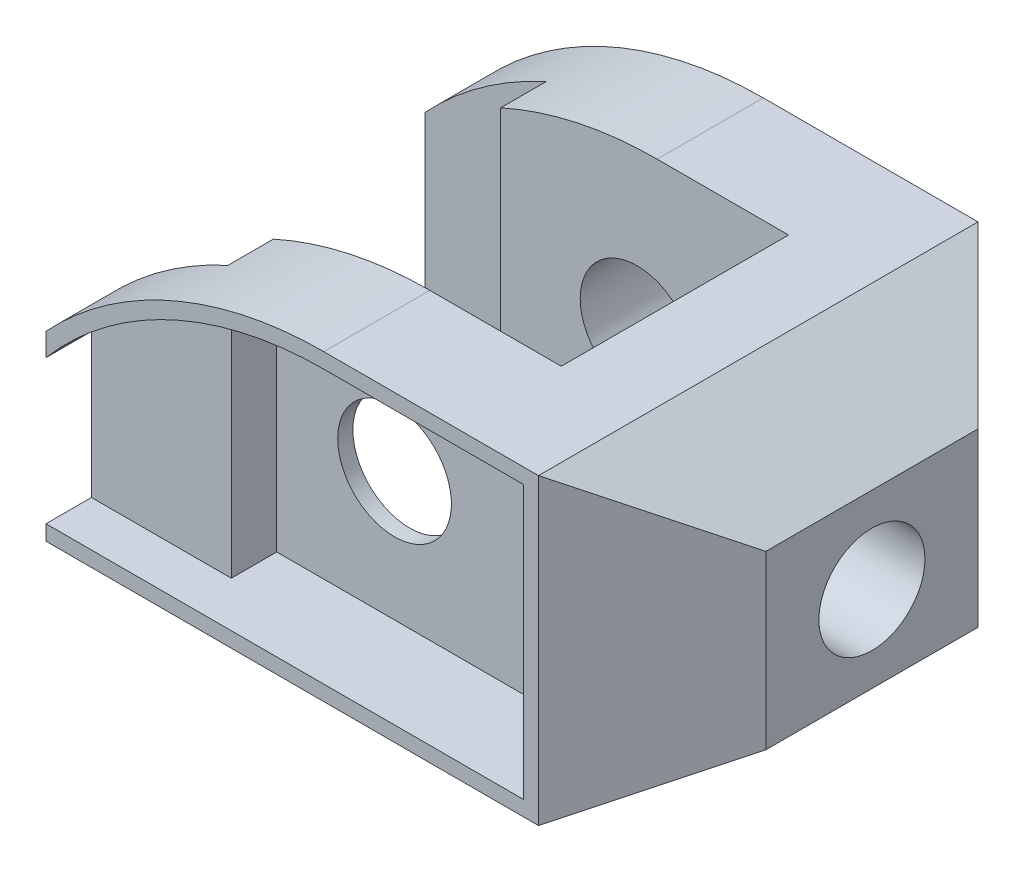
ISO-10303-21;
HEADER;
FILE_DESCRIPTION(('STEP AP214'),'2;1');
FILE_NAME('part.step','',(''),(''),'','','');
FILE_SCHEMA(('AUTOMOTIVE_DESIGN { 1 0 10303 214 1 1 1 1 }'));
ENDSEC;
DATA;
#1=APPLICATION_CONTEXT('core data for automotive mechanical design processes');
#2=APPLICATION_PROTOCOL_DEFINITION('international standard','automotive_design',2000,#1);
#3=PRODUCT_CONTEXT('',#1,'mechanical');
#4=PRODUCT('Part','Part','',(#3));
#5=PRODUCT_RELATED_PRODUCT_CATEGORY('part','',(#4));
#6=PRODUCT_DEFINITION_FORMATION('','',#4);
#7=PRODUCT_DEFINITION_CONTEXT('part definition',#1,'design');
#8=PRODUCT_DEFINITION('design','',#6,#7);
#9=PRODUCT_DEFINITION_SHAPE('','',#8);
#10=(LENGTH_UNIT() NAMED_UNIT(*) SI_UNIT(.MILLI.,.METRE.));
#11=(NAMED_UNIT(*) PLANE_ANGLE_UNIT() SI_UNIT($,.RADIAN.));
#12=(NAMED_UNIT(*) SI_UNIT($,.STERADIAN.) SOLID_ANGLE_UNIT());
#13=UNCERTAINTY_MEASURE_WITH_UNIT(LENGTH_MEASURE(1.E-05),#10,'distance_accuracy_value','');
#14=(GEOMETRIC_REPRESENTATION_CONTEXT(3) GLOBAL_UNCERTAINTY_ASSIGNED_CONTEXT((#13)) GLOBAL_UNIT_ASSIGNED_CONTEXT((#10,
#11,#12)) REPRESENTATION_CONTEXT('',''));
#15=CARTESIAN_POINT('',(0.,0.,0.));
#16=DIRECTION('',(0.,0.,1.));
#17=DIRECTION('',(1.,0.,0.));
#18=AXIS2_PLACEMENT_3D('',#15,#16,#17);
#19=CARTESIAN_POINT('',(34.,19.,29.));
#20=DIRECTION('',(0.,0.,-1.));
#21=DIRECTION('',(-1.,0.,0.));
#22=AXIS2_PLACEMENT_3D('',#19,#20,#21);
#23=CYLINDRICAL_SURFACE('',#22,7.5);
#24=CARTESIAN_POINT('',(34.,19.,15.));
#25=DIRECTION('',(0.,0.,1.));
#26=DIRECTION('',(1.,0.,0.));
#27=AXIS2_PLACEMENT_3D('',#24,#25,#26);
#28=CIRCLE('',#27,7.5);
#29=CARTESIAN_POINT('',(26.5,19.,15.));
#30=VERTEX_POINT('',#29);
#31=EDGE_CURVE('E317',#30,#30,#28,.T.);
#32=CARTESIAN_POINT('',(34.,19.,17.));
#33=DIRECTION('',(0.,0.,1.));
#34=DIRECTION('',(1.,0.,0.));
#35=AXIS2_PLACEMENT_3D('',#32,#33,#34);
#36=CIRCLE('',#35,7.5);
#37=CARTESIAN_POINT('',(26.5,19.,17.));
#38=VERTEX_POINT('',#37);
#39=EDGE_CURVE('E46',#38,#38,#36,.T.);
#40=CARTESIAN_POINT('',(26.5,19.,15.));
#41=CARTESIAN_POINT('',(26.5,19.,15.0208333333333));
#42=CARTESIAN_POINT('',(26.5,19.,15.0416666666667));
#43=CARTESIAN_POINT('',(26.5,19.,15.0833333333333));
#44=CARTESIAN_POINT('',(26.5,19.,15.1041666666667));
#45=CARTESIAN_POINT('',(26.5,19.,15.1458333333333));
#46=CARTESIAN_POINT('',(26.5,19.,15.1666666666667));
#47=CARTESIAN_POINT('',(26.5,19.,15.2083333333333));
#48=CARTESIAN_POINT('',(26.5,19.,15.2291666666667));
#49=CARTESIAN_POINT('',(26.5,19.,15.2708333333333));
#50=CARTESIAN_POINT('',(26.5,19.,15.2916666666667));
#51=CARTESIAN_POINT('',(26.5,19.,15.3333333333333));
#52=CARTESIAN_POINT('',(26.5,19.,15.3541666666667));
#53=CARTESIAN_POINT('',(26.5,19.,15.3958333333333));
#54=CARTESIAN_POINT('',(26.5,19.,15.4166666666667));
#55=CARTESIAN_POINT('',(26.5,19.,15.4583333333333));
#56=CARTESIAN_POINT('',(26.5,19.,15.4791666666667));
#57=CARTESIAN_POINT('',(26.5,19.,15.5208333333333));
#58=CARTESIAN_POINT('',(26.5,19.,15.5416666666667));
#59=CARTESIAN_POINT('',(26.5,19.,15.5833333333333));
#60=CARTESIAN_POINT('',(26.5,19.,15.6041666666667));
#61=CARTESIAN_POINT('',(26.5,19.,15.6458333333333));
#62=CARTESIAN_POINT('',(26.5,19.,15.6666666666667));
#63=CARTESIAN_POINT('',(26.5,19.,15.7083333333333));
#64=CARTESIAN_POINT('',(26.5,19.,15.7291666666667));
#65=CARTESIAN_POINT('',(26.5,19.,15.7708333333333));
#66=CARTESIAN_POINT('',(26.5,19.,15.7916666666667));
#67=CARTESIAN_POINT('',(26.5,19.,15.8333333333333));
#68=CARTESIAN_POINT('',(26.5,19.,15.8541666666667));
#69=CARTESIAN_POINT('',(26.5,19.,15.8958333333333));
#70=CARTESIAN_POINT('',(26.5,19.,15.9166666666667));
#71=CARTESIAN_POINT('',(26.5,19.,15.9583333333333));
#72=CARTESIAN_POINT('',(26.5,19.,15.9791666666667));
#73=CARTESIAN_POINT('',(26.5,19.,16.0208333333333));
#74=CARTESIAN_POINT('',(26.5,19.,16.0416666666667));
#75=CARTESIAN_POINT('',(26.5,19.,16.0833333333333));
#76=CARTESIAN_POINT('',(26.5,19.,16.1041666666667));
#77=CARTESIAN_POINT('',(26.5,19.,16.1458333333333));
#78=CARTESIAN_POINT('',(26.5,19.,16.1666666666667));
#79=CARTESIAN_POINT('',(26.5,19.,16.2083333333333));
#80=CARTESIAN_POINT('',(26.5,19.,16.2291666666667));
#81=CARTESIAN_POINT('',(26.5,19.,16.2708333333333));
#82=CARTESIAN_POINT('',(26.5,19.,16.2916666666667));
#83=CARTESIAN_POINT('',(26.5,19.,16.3333333333333));
#84=CARTESIAN_POINT('',(26.5,19.,16.3541666666667));
#85=CARTESIAN_POINT('',(26.5,19.,16.3958333333333));
#86=CARTESIAN_POINT('',(26.5,19.,16.4166666666667));
#87=CARTESIAN_POINT('',(26.5,19.,16.4583333333333));
#88=CARTESIAN_POINT('',(26.5,19.,16.4791666666667));
#89=CARTESIAN_POINT('',(26.5,19.,16.5208333333333));
#90=CARTESIAN_POINT('',(26.5,19.,16.5416666666667));
#91=CARTESIAN_POINT('',(26.5,19.,16.5833333333333));
#92=CARTESIAN_POINT('',(26.5,19.,16.6041666666667));
#93=CARTESIAN_POINT('',(26.5,19.,16.6458333333333));
#94=CARTESIAN_POINT('',(26.5,19.,16.6666666666667));
#95=CARTESIAN_POINT('',(26.5,19.,16.7083333333333));
#96=CARTESIAN_POINT('',(26.5,19.,16.7291666666667));
#97=CARTESIAN_POINT('',(26.5,19.,16.7708333333333));
#98=CARTESIAN_POINT('',(26.5,19.,16.7916666666667));
#99=CARTESIAN_POINT('',(26.5,19.,16.8333333333333));
#100=CARTESIAN_POINT('',(26.5,19.,16.8541666666667));
#101=CARTESIAN_POINT('',(26.5,19.,16.8958333333333));
#102=CARTESIAN_POINT('',(26.5,19.,16.9166666666667));
#103=CARTESIAN_POINT('',(26.5,19.,16.9583333333333));
#104=CARTESIAN_POINT('',(26.5,19.,16.9791666666667));
#105=CARTESIAN_POINT('',(26.5,19.,17.));
#106=B_SPLINE_CURVE_WITH_KNOTS('',3,(#40,#41,#42,#43,#44,#45,#46,#47,#48,#49,#50,#51,#52,#53,
#54,#55,#56,#57,#58,#59,#60,#61,#62,#63,#64,#65,#66,#67,#68,#69,#70,#71,#72,#73,#74,#75,#76,#77,
#78,#79,#80,#81,#82,#83,#84,#85,#86,#87,#88,#89,#90,#91,#92,#93,#94,#95,#96,#97,#98,#99,#100,
#101,#102,#103,#104,#105),.UNSPECIFIED.,.F.,.F.,(4,2,2,2,2,2,2,2,2,2,2,2,2,2,2,2,2,2,2,2,2,2,2,
2,2,2,2,2,2,2,2,2,4),(0.,0.0625000000000001,0.125,0.187499999999998,0.249999999999999,
0.312499999999999,0.374999999999999,0.437499999999999,0.499999999999997,0.562499999999997,
0.624999999999999,0.687499999999999,0.749999999999999,0.812499999999999,0.874999999999996,
0.937499999999996,0.999999999999996,1.0625,1.125,1.18749999999999,1.24999999999999,
1.31249999999999,1.37499999999999,1.43749999999999,1.49999999999999,1.56249999999999,
1.62499999999999,1.68749999999999,1.74999999999999,1.81249999999999,1.87499999999999,
1.93749999999999,1.99999999999999),.UNSPECIFIED.);
#107=EDGE_CURVE('BSEAM42',#30,#38,#106,.T.);
#108=ORIENTED_EDGE('',*,*,#31,.F.);
#109=ORIENTED_EDGE('',*,*,#39,.T.);
#110=ORIENTED_EDGE('',*,*,#107,.T.);
#111=ORIENTED_EDGE('',*,*,#107,.F.);
#112=EDGE_LOOP('',(#108,#110,#109,#111));
#113=FACE_BOUND('',#112,.T.);
#114=ADVANCED_FACE('F42',(#113),#23,.F.);
#115=CARTESIAN_POINT('',(36.6606055596467,-10.,29.));
#116=DIRECTION('',(0.,0.,-1.));
#117=DIRECTION('',(-1.,0.,0.));
#118=AXIS2_PLACEMENT_3D('',#115,#116,#117);
#119=CYLINDRICAL_SURFACE('',#118,50.);
#120=DIRECTION('',(0.,0.,-1.));
#121=VECTOR('',#120,1.);
#122=CARTESIAN_POINT('',(0.,24.,29.));
#123=LINE('',#122,#121);
#124=CARTESIAN_POINT('',(0.,24.,-21.));
#125=VERTEX_POINT('',#124);
#126=CARTESIAN_POINT('',(0.,24.,-29.));
#127=VERTEX_POINT('',#126);
#128=EDGE_CURVE('E369',#125,#127,#123,.T.);
#129=ORIENTED_EDGE('',*,*,#128,.F.);
#130=CARTESIAN_POINT('',(36.6606055596467,-10.,-21.));
#131=DIRECTION('',(0.,0.,-1.));
#132=DIRECTION('',(-1.,0.,0.));
#133=AXIS2_PLACEMENT_3D('',#130,#131,#132);
#134=CIRCLE('',#133,50.);
#135=CARTESIAN_POINT('',(16.,35.5317403347236,-21.));
#136=VERTEX_POINT('',#135);
#137=EDGE_CURVE('E330',#125,#136,#134,.T.);
#138=ORIENTED_EDGE('',*,*,#137,.T.);
#139=DIRECTION('',(0.,0.,-1.));
#140=VECTOR('',#139,1.);
#141=CARTESIAN_POINT('',(16.,35.5317403347236,29.));
#142=LINE('',#141,#140);
#143=CARTESIAN_POINT('',(16.,35.5317403347236,-15.));
#144=VERTEX_POINT('',#143);
#145=EDGE_CURVE('E396',#136,#144,#142,.F.);
#146=ORIENTED_EDGE('',*,*,#145,.T.);
#147=CARTESIAN_POINT('',(36.6606055596467,-10.,-15.));
#148=DIRECTION('',(0.,0.,-1.));
#149=DIRECTION('',(-1.,0.,0.));
#150=AXIS2_PLACEMENT_3D('',#147,#148,#149);
#151=CIRCLE('',#150,50.);
#152=CARTESIAN_POINT('',(36.6606055596467,40.,-15.));
#153=VERTEX_POINT('',#152);
#154=EDGE_CURVE('E324',#144,#153,#151,.T.);
#155=ORIENTED_EDGE('',*,*,#154,.T.);
#156=DIRECTION('',(0.,0.,-1.));
#157=VECTOR('',#156,1.);
#158=CARTESIAN_POINT('',(36.6606055596467,40.,29.));
#159=LINE('',#158,#157);
#160=CARTESIAN_POINT('',(36.6606055596467,40.,-29.));
#161=VERTEX_POINT('',#160);
#162=EDGE_CURVE('E373',#153,#161,#159,.T.);
#163=ORIENTED_EDGE('',*,*,#162,.T.);
#164=CARTESIAN_POINT('',(36.6606055596467,-10.,-29.));
#165=DIRECTION('',(0.,0.,1.));
#166=DIRECTION('',(-1.,0.,0.));
#167=AXIS2_PLACEMENT_3D('',#164,#165,#166);
#168=CIRCLE('',#167,50.);
#169=EDGE_CURVE('E361',#161,#127,#168,.T.);
#170=ORIENTED_EDGE('',*,*,#169,.T.);
#171=EDGE_LOOP('',(#129,#138,#146,#155,#163,#170));
#172=FACE_BOUND('',#171,.T.);
#173=ADVANCED_FACE('F425',(#172),#119,.T.);
#174=CARTESIAN_POINT('',(0.,0.,29.));
#175=DIRECTION('',(1.,0.,0.));
#176=DIRECTION('',(0.,0.,-1.));
#177=AXIS2_PLACEMENT_3D('',#174,#175,#176);
#178=PLANE('',#177);
#179=DIRECTION('',(0.,0.,-1.));
#180=VECTOR('',#179,1.);
#181=CARTESIAN_POINT('',(0.,0.,29.));
#182=LINE('',#181,#180);
#183=CARTESIAN_POINT('',(0.,0.,-21.));
#184=VERTEX_POINT('',#183);
#185=CARTESIAN_POINT('',(0.,0.,-29.));
#186=VERTEX_POINT('',#185);
#187=EDGE_CURVE('E355',#184,#186,#182,.T.);
#188=ORIENTED_EDGE('',*,*,#187,.F.);
#189=DIRECTION('',(0.,1.,0.));
#190=VECTOR('',#189,1.);
#191=CARTESIAN_POINT('',(0.,0.,-21.));
#192=LINE('',#191,#190);
#193=EDGE_CURVE('E279',#184,#125,#192,.T.);
#194=ORIENTED_EDGE('',*,*,#193,.T.);
#195=ORIENTED_EDGE('',*,*,#128,.T.);
#196=DIRECTION('',(0.,-1.,0.));
#197=VECTOR('',#196,1.);
#198=CARTESIAN_POINT('',(0.,0.,-29.));
#199=LINE('',#198,#197);
#200=EDGE_CURVE('E347',#127,#186,#199,.T.);
#201=ORIENTED_EDGE('',*,*,#200,.T.);
#202=EDGE_LOOP('',(#188,#194,#195,#201));
#203=FACE_BOUND('',#202,.T.);
#204=ADVANCED_FACE('F433',(#203),#178,.F.);
#205=CARTESIAN_POINT('',(34.,19.,-15.));
#206=DIRECTION('',(0.,0.,-1.));
#207=DIRECTION('',(-1.,0.,0.));
#208=AXIS2_PLACEMENT_3D('',#205,#206,#207);
#209=CIRCLE('',#208,7.5);
#210=CARTESIAN_POINT('',(26.5,19.,-15.));
#211=VERTEX_POINT('',#210);
#212=EDGE_CURVE('E323',#211,#211,#209,.T.);
#213=CARTESIAN_POINT('',(34.,19.,-29.));
#214=DIRECTION('',(0.,0.,1.));
#215=DIRECTION('',(1.,0.,0.));
#216=AXIS2_PLACEMENT_3D('',#213,#214,#215);
#217=CIRCLE('',#216,7.5);
#218=CARTESIAN_POINT('',(26.5,19.,-29.));
#219=VERTEX_POINT('',#218);
#220=EDGE_CURVE('E339',#219,#219,#217,.T.);
#221=CARTESIAN_POINT('',(26.5,19.,-15.));
#222=CARTESIAN_POINT('',(26.5,19.,-15.1458333333333));
#223=CARTESIAN_POINT('',(26.5,19.,-15.2916666666667));
#224=CARTESIAN_POINT('',(26.5,19.,-15.5833333333333));
#225=CARTESIAN_POINT('',(26.5,19.,-15.7291666666667));
#226=CARTESIAN_POINT('',(26.5,19.,-16.0208333333333));
#227=CARTESIAN_POINT('',(26.5,19.,-16.1666666666667));
#228=CARTESIAN_POINT('',(26.5,19.,-16.4583333333333));
#229=CARTESIAN_POINT('',(26.5,19.,-16.6041666666667));
#230=CARTESIAN_POINT('',(26.5,19.,-16.8958333333333));
#231=CARTESIAN_POINT('',(26.5,19.,-17.0416666666667));
#232=CARTESIAN_POINT('',(26.5,19.,-17.3333333333333));
#233=CARTESIAN_POINT('',(26.5,19.,-17.4791666666667));
#234=CARTESIAN_POINT('',(26.5,19.,-17.7708333333333));
#235=CARTESIAN_POINT('',(26.5,19.,-17.9166666666667));
#236=CARTESIAN_POINT('',(26.5,19.,-18.2083333333333));
#237=CARTESIAN_POINT('',(26.5,19.,-18.3541666666667));
#238=CARTESIAN_POINT('',(26.5,19.,-18.6458333333333));
#239=CARTESIAN_POINT('',(26.5,19.,-18.7916666666667));
#240=CARTESIAN_POINT('',(26.5,19.,-19.0833333333333));
#241=CARTESIAN_POINT('',(26.5,19.,-19.2291666666667));
#242=CARTESIAN_POINT('',(26.5,19.,-19.5208333333333));
#243=CARTESIAN_POINT('',(26.5,19.,-19.6666666666667));
#244=CARTESIAN_POINT('',(26.5,19.,-19.9583333333333));
#245=CARTESIAN_POINT('',(26.5,19.,-20.1041666666667));
#246=CARTESIAN_POINT('',(26.5,19.,-20.3958333333333));
#247=CARTESIAN_POINT('',(26.5,19.,-20.5416666666667));
#248=CARTESIAN_POINT('',(26.5,19.,-20.8333333333333));
#249=CARTESIAN_POINT('',(26.5,19.,-20.9791666666667));
#250=CARTESIAN_POINT('',(26.5,19.,-21.2708333333333));
#251=CARTESIAN_POINT('',(26.5,19.,-21.4166666666667));
#252=CARTESIAN_POINT('',(26.5,19.,-21.7083333333333));
#253=CARTESIAN_POINT('',(26.5,19.,-21.8541666666667));
#254=CARTESIAN_POINT('',(26.5,19.,-22.1458333333333));
#255=CARTESIAN_POINT('',(26.5,19.,-22.2916666666667));
#256=CARTESIAN_POINT('',(26.5,19.,-22.5833333333333));
#257=CARTESIAN_POINT('',(26.5,19.,-22.7291666666667));
#258=CARTESIAN_POINT('',(26.5,19.,-23.0208333333333));
#259=CARTESIAN_POINT('',(26.5,19.,-23.1666666666667));
#260=CARTESIAN_POINT('',(26.5,19.,-23.4583333333333));
#261=CARTESIAN_POINT('',(26.5,19.,-23.6041666666667));
#262=CARTESIAN_POINT('',(26.5,19.,-23.8958333333333));
#263=CARTESIAN_POINT('',(26.5,19.,-24.0416666666667));
#264=CARTESIAN_POINT('',(26.5,19.,-24.3333333333333));
#265=CARTESIAN_POINT('',(26.5,19.,-24.4791666666667));
#266=CARTESIAN_POINT('',(26.5,19.,-24.7708333333333));
#267=CARTESIAN_POINT('',(26.5,19.,-24.9166666666667));
#268=CARTESIAN_POINT('',(26.5,19.,-25.2083333333333));
#269=CARTESIAN_POINT('',(26.5,19.,-25.3541666666667));
#270=CARTESIAN_POINT('',(26.5,19.,-25.6458333333333));
#271=CARTESIAN_POINT('',(26.5,19.,-25.7916666666667));
#272=CARTESIAN_POINT('',(26.5,19.,-26.0833333333333));
#273=CARTESIAN_POINT('',(26.5,19.,-26.2291666666667));
#274=CARTESIAN_POINT('',(26.5,19.,-26.5208333333333));
#275=CARTESIAN_POINT('',(26.5,19.,-26.6666666666667));
#276=CARTESIAN_POINT('',(26.5,19.,-26.9583333333333));
#277=CARTESIAN_POINT('',(26.5,19.,-27.1041666666667));
#278=CARTESIAN_POINT('',(26.5,19.,-27.3958333333333));
#279=CARTESIAN_POINT('',(26.5,19.,-27.5416666666667));
#280=CARTESIAN_POINT('',(26.5,19.,-27.8333333333333));
#281=CARTESIAN_POINT('',(26.5,19.,-27.9791666666667));
#282=CARTESIAN_POINT('',(26.5,19.,-28.2708333333333));
#283=CARTESIAN_POINT('',(26.5,19.,-28.4166666666667));
#284=CARTESIAN_POINT('',(26.5,19.,-28.7083333333333));
#285=CARTESIAN_POINT('',(26.5,19.,-28.8541666666667));
#286=CARTESIAN_POINT('',(26.5,19.,-29.));
#287=B_SPLINE_CURVE_WITH_KNOTS('',3,(#221,#222,#223,#224,#225,#226,#227,#228,#229,#230,#231,
#232,#233,#234,#235,#236,#237,#238,#239,#240,#241,#242,#243,#244,#245,#246,#247,#248,#249,#250,
#251,#252,#253,#254,#255,#256,#257,#258,#259,#260,#261,#262,#263,#264,#265,#266,#267,#268,#269,
#270,#271,#272,#273,#274,#275,#276,#277,#278,#279,#280,#281,#282,#283,#284,#285,#286),
.UNSPECIFIED.,.F.,.F.,(4,2,2,2,2,2,2,2,2,2,2,2,2,2,2,2,2,2,2,2,2,2,2,2,2,2,2,2,2,2,2,2,4),(0.,
0.4375,0.875000000000001,1.3125,1.75,2.1875,2.625,3.0625,3.5,3.9375,4.375,4.8125,5.25,5.6875,
6.125,6.5625,7.,7.4375,7.875,8.3125,8.75,9.1875,9.62499999999999,10.0625,10.5,10.9375,11.375,
11.8125,12.25,12.6875,13.125,13.5625,14.),.UNSPECIFIED.);
#288=EDGE_CURVE('BSEAM428',#211,#219,#287,.T.);
#289=ORIENTED_EDGE('',*,*,#212,.F.);
#290=ORIENTED_EDGE('',*,*,#220,.F.);
#291=ORIENTED_EDGE('',*,*,#288,.T.);
#292=ORIENTED_EDGE('',*,*,#288,.F.);
#293=EDGE_LOOP('',(#289,#291,#290,#292));
#294=FACE_BOUND('',#293,.T.);
#295=ADVANCED_FACE('F428',(#294),#23,.F.);
#296=CARTESIAN_POINT('',(36.6606055596467,-10.,29.));
#297=DIRECTION('',(0.,0.,-1.));
#298=DIRECTION('',(-1.,0.,0.));
#299=AXIS2_PLACEMENT_3D('',#296,#297,#298);
#300=PLANE('',#299);
#301=DIRECTION('',(0.,1.,0.));
#302=VECTOR('',#301,1.);
#303=CARTESIAN_POINT('',(63.,1.99999999999999,29.));
#304=LINE('',#303,#302);
#305=CARTESIAN_POINT('',(63.,1.99999999999999,29.));
#306=VERTEX_POINT('',#305);
#307=CARTESIAN_POINT('',(63.,38.,29.));
#308=VERTEX_POINT('',#307);
#309=EDGE_CURVE('E238',#306,#308,#304,.T.);
#310=ORIENTED_EDGE('',*,*,#309,.F.);
#311=DIRECTION('',(1.,0.,0.));
#312=VECTOR('',#311,1.);
#313=CARTESIAN_POINT('',(0.,2.,29.));
#314=LINE('',#313,#312);
#315=CARTESIAN_POINT('',(0.,2.,29.));
#316=VERTEX_POINT('',#315);
#317=EDGE_CURVE('E235',#316,#306,#314,.T.);
#318=ORIENTED_EDGE('',*,*,#317,.F.);
#319=DIRECTION('',(0.,-1.,0.));
#320=VECTOR('',#319,1.);
#321=CARTESIAN_POINT('',(0.,0.,29.));
#322=LINE('',#321,#320);
#323=CARTESIAN_POINT('',(0.,0.,29.));
#324=VERTEX_POINT('',#323);
#325=EDGE_CURVE('E351',#316,#324,#322,.T.);
#326=ORIENTED_EDGE('',*,*,#325,.T.);
#327=DIRECTION('',(1.,0.,0.));
#328=VECTOR('',#327,1.);
#329=CARTESIAN_POINT('',(0.,0.,29.));
#330=LINE('',#329,#328);
#331=CARTESIAN_POINT('',(65.,0.,29.));
#332=VERTEX_POINT('',#331);
#333=EDGE_CURVE('E343',#324,#332,#330,.T.);
#334=ORIENTED_EDGE('',*,*,#333,.T.);
#335=DIRECTION('',(0.,1.,0.));
#336=VECTOR('',#335,1.);
#337=CARTESIAN_POINT('',(65.,0.,29.));
#338=LINE('',#337,#336);
#339=CARTESIAN_POINT('',(65.,40.,29.));
#340=VERTEX_POINT('',#339);
#341=EDGE_CURVE('E312',#332,#340,#338,.T.);
#342=ORIENTED_EDGE('',*,*,#341,.T.);
#343=DIRECTION('',(-1.,0.,0.));
#344=VECTOR('',#343,1.);
#345=CARTESIAN_POINT('',(65.,40.,29.));
#346=LINE('',#345,#344);
#347=CARTESIAN_POINT('',(36.6606055596467,40.,29.));
#348=VERTEX_POINT('',#347);
#349=EDGE_CURVE('E346',#340,#348,#346,.T.);
#350=ORIENTED_EDGE('',*,*,#349,.T.);
#351=CARTESIAN_POINT('',(36.6606055596467,-10.,29.));
#352=DIRECTION('',(0.,0.,1.));
#353=DIRECTION('',(-1.,0.,0.));
#354=AXIS2_PLACEMENT_3D('',#351,#352,#353);
#355=CIRCLE('',#354,50.);
#356=CARTESIAN_POINT('',(0.,24.,29.));
#357=VERTEX_POINT('',#356);
#358=EDGE_CURVE('E349',#348,#357,#355,.T.);
#359=ORIENTED_EDGE('',*,*,#358,.T.);
#360=CARTESIAN_POINT('',(0.,20.9838667696593,29.));
#361=VERTEX_POINT('',#360);
#362=EDGE_CURVE('E352',#357,#361,#322,.T.);
#363=ORIENTED_EDGE('',*,*,#362,.T.);
#364=CARTESIAN_POINT('',(36.6606055596467,-10.,29.));
#365=DIRECTION('',(0.,0.,1.));
#366=DIRECTION('',(1.,0.,0.));
#367=AXIS2_PLACEMENT_3D('',#364,#365,#366);
#368=CIRCLE('',#367,48.);
#369=CARTESIAN_POINT('',(36.6606055596467,38.,29.));
#370=VERTEX_POINT('',#369);
#371=EDGE_CURVE('E230',#370,#361,#368,.T.);
#372=ORIENTED_EDGE('',*,*,#371,.F.);
#373=DIRECTION('',(-1.,0.,0.));
#374=VECTOR('',#373,1.);
#375=CARTESIAN_POINT('',(63.,38.,29.));
#376=LINE('',#375,#374);
#377=EDGE_CURVE('E241',#308,#370,#376,.T.);
#378=ORIENTED_EDGE('',*,*,#377,.F.);
#379=EDGE_LOOP('',(#310,#318,#326,#334,#342,#350,#359,#363,#372,#378));
#380=FACE_BOUND('',#379,.T.);
#381=ADVANCED_FACE('F442',(#380),#300,.F.);
#382=CARTESIAN_POINT('',(36.6606055596467,-10.,-29.));
#383=DIRECTION('',(0.,0.,-1.));
#384=DIRECTION('',(-1.,0.,0.));
#385=AXIS2_PLACEMENT_3D('',#382,#383,#384);
#386=PLANE('',#385);
#387=DIRECTION('',(0.,1.,0.));
#388=VECTOR('',#387,1.);
#389=CARTESIAN_POINT('',(65.,0.,-29.));
#390=LINE('',#389,#388);
#391=CARTESIAN_POINT('',(65.,0.,-29.));
#392=VERTEX_POINT('',#391);
#393=CARTESIAN_POINT('',(65.,40.,-29.));
#394=VERTEX_POINT('',#393);
#395=EDGE_CURVE('E315',#392,#394,#390,.T.);
#396=ORIENTED_EDGE('',*,*,#395,.F.);
#397=DIRECTION('',(1.,0.,0.));
#398=VECTOR('',#397,1.);
#399=CARTESIAN_POINT('',(0.,0.,-29.));
#400=LINE('',#399,#398);
#401=EDGE_CURVE('E342',#186,#392,#400,.T.);
#402=ORIENTED_EDGE('',*,*,#401,.F.);
#403=ORIENTED_EDGE('',*,*,#200,.F.);
#404=ORIENTED_EDGE('',*,*,#169,.F.);
#405=DIRECTION('',(-1.,0.,0.));
#406=VECTOR('',#405,1.);
#407=CARTESIAN_POINT('',(65.,40.,-29.));
#408=LINE('',#407,#406);
#409=EDGE_CURVE('E358',#394,#161,#408,.T.);
#410=ORIENTED_EDGE('',*,*,#409,.F.);
#411=EDGE_LOOP('',(#396,#402,#403,#404,#410));
#412=FACE_BOUND('',#411,.T.);
#413=ORIENTED_EDGE('',*,*,#220,.T.);
#414=EDGE_LOOP('',(#413));
#415=FACE_BOUND('',#414,.T.);
#416=ADVANCED_FACE('F448',(#412,#415),#386,.T.);
#417=CARTESIAN_POINT('',(0.,0.,29.));
#418=DIRECTION('',(0.,1.,0.));
#419=DIRECTION('',(0.,0.,1.));
#420=AXIS2_PLACEMENT_3D('',#417,#418,#419);
#421=PLANE('',#420);
#422=DIRECTION('',(0.,0.,-1.));
#423=VECTOR('',#422,1.);
#424=CARTESIAN_POINT('',(16.,0.,-21.));
#425=LINE('',#424,#423);
#426=CARTESIAN_POINT('',(16.,0.,-15.));
#427=VERTEX_POINT('',#426);
#428=CARTESIAN_POINT('',(16.,0.,-21.));
#429=VERTEX_POINT('',#428);
#430=EDGE_CURVE('E294',#427,#429,#425,.T.);
#431=ORIENTED_EDGE('',*,*,#430,.T.);
#432=DIRECTION('',(-1.,0.,0.));
#433=VECTOR('',#432,1.);
#434=CARTESIAN_POINT('',(0.,0.,-21.));
#435=LINE('',#434,#433);
#436=EDGE_CURVE('E261',#429,#184,#435,.T.);
#437=ORIENTED_EDGE('',*,*,#436,.T.);
#438=ORIENTED_EDGE('',*,*,#187,.T.);
#439=ORIENTED_EDGE('',*,*,#401,.T.);
#440=DIRECTION('',(0.,0.,-1.));
#441=VECTOR('',#440,1.);
#442=CARTESIAN_POINT('',(65.,0.,29.));
#443=LINE('',#442,#441);
#444=EDGE_CURVE('E386',#332,#392,#443,.T.);
#445=ORIENTED_EDGE('',*,*,#444,.F.);
#446=ORIENTED_EDGE('',*,*,#333,.F.);
#447=CARTESIAN_POINT('',(0.,0.,21.));
#448=VERTEX_POINT('',#447);
#449=EDGE_CURVE('E366',#324,#448,#182,.T.);
#450=ORIENTED_EDGE('',*,*,#449,.T.);
#451=DIRECTION('',(1.,0.,0.));
#452=VECTOR('',#451,1.);
#453=CARTESIAN_POINT('',(0.,0.,21.));
#454=LINE('',#453,#452);
#455=CARTESIAN_POINT('',(16.,0.,21.));
#456=VERTEX_POINT('',#455);
#457=EDGE_CURVE('E286',#448,#456,#454,.T.);
#458=ORIENTED_EDGE('',*,*,#457,.T.);
#459=DIRECTION('',(0.,0.,-1.));
#460=VECTOR('',#459,1.);
#461=CARTESIAN_POINT('',(16.,0.,21.));
#462=LINE('',#461,#460);
#463=CARTESIAN_POINT('',(16.,0.,15.));
#464=VERTEX_POINT('',#463);
#465=EDGE_CURVE('E306',#456,#464,#462,.T.);
#466=ORIENTED_EDGE('',*,*,#465,.T.);
#467=DIRECTION('',(1.,0.,0.));
#468=VECTOR('',#467,1.);
#469=CARTESIAN_POINT('',(16.,0.,15.));
#470=LINE('',#469,#468);
#471=CARTESIAN_POINT('',(54.,0.,15.));
#472=VERTEX_POINT('',#471);
#473=EDGE_CURVE('E303',#464,#472,#470,.T.);
#474=ORIENTED_EDGE('',*,*,#473,.T.);
#475=DIRECTION('',(0.,0.,-1.));
#476=VECTOR('',#475,1.);
#477=CARTESIAN_POINT('',(54.,0.,-15.));
#478=LINE('',#477,#476);
#479=CARTESIAN_POINT('',(54.,0.,-15.));
#480=VERTEX_POINT('',#479);
#481=EDGE_CURVE('E300',#472,#480,#478,.T.);
#482=ORIENTED_EDGE('',*,*,#481,.T.);
#483=DIRECTION('',(-1.,0.,0.));
#484=VECTOR('',#483,1.);
#485=CARTESIAN_POINT('',(16.,0.,-15.));
#486=LINE('',#485,#484);
#487=EDGE_CURVE('E297',#480,#427,#486,.T.);
#488=ORIENTED_EDGE('',*,*,#487,.T.);
#489=EDGE_LOOP('',(#431,#437,#438,#439,#445,#446,#450,#458,#466,#474,#482,#488));
#490=FACE_BOUND('',#489,.T.);
#491=ADVANCED_FACE('F44',(#490),#421,.F.);
#492=CARTESIAN_POINT('',(65.,0.,29.));
#493=DIRECTION('',(-0.500000000000001,0.866025403784438,0.));
#494=DIRECTION('',(-0.866025403784438,-0.500000000000001,0.));
#495=AXIS2_PLACEMENT_3D('',#492,#493,#494);
#496=PLANE('',#495);
#497=DIRECTION('',(0.,0.,-1.));
#498=VECTOR('',#497,1.);
#499=CARTESIAN_POINT('',(80.,8.66025403784441,29.));
#500=LINE('',#499,#498);
#501=CARTESIAN_POINT('',(80.,8.66025403784441,14.0000000000002));
#502=VERTEX_POINT('',#501);
#503=CARTESIAN_POINT('',(80.,8.66025403784441,-14.0000000000002));
#504=VERTEX_POINT('',#503);
#505=EDGE_CURVE('E383',#502,#504,#500,.T.);
#506=ORIENTED_EDGE('',*,*,#505,.F.);
#507=DIRECTION('',(-0.65465367070798,-0.37796447300923,0.654653670707973));
#508=VECTOR('',#507,1.);
#509=CARTESIAN_POINT('',(65.,0.,29.));
#510=LINE('',#509,#508);
#511=EDGE_CURVE('E336',#502,#332,#510,.T.);
#512=ORIENTED_EDGE('',*,*,#511,.T.);
#513=ORIENTED_EDGE('',*,*,#444,.T.);
#514=DIRECTION('',(0.65465367070798,0.37796447300923,0.654653670707973));
#515=VECTOR('',#514,1.);
#516=CARTESIAN_POINT('',(89.8571428571428,14.3512781198564,-4.14285714285749));
#517=LINE('',#516,#515);
#518=EDGE_CURVE('E333',#392,#504,#517,.T.);
#519=ORIENTED_EDGE('',*,*,#518,.T.);
#520=EDGE_LOOP('',(#506,#512,#513,#519));
#521=FACE_BOUND('',#520,.T.);
#522=ADVANCED_FACE('F462',(#521),#496,.F.);
#523=CARTESIAN_POINT('',(80.,8.66025403784441,29.));
#524=DIRECTION('',(-1.,0.,0.));
#525=DIRECTION('',(0.,0.,1.));
#526=AXIS2_PLACEMENT_3D('',#523,#524,#525);
#527=PLANE('',#526);
#528=CARTESIAN_POINT('',(80.,20.0000000000001,0.));
#529=DIRECTION('',(1.,0.,0.));
#530=DIRECTION('',(0.,0.,-1.));
#531=AXIS2_PLACEMENT_3D('',#528,#529,#530);
#532=CIRCLE('',#531,7.);
#533=CARTESIAN_POINT('',(80.,20.0000000000001,-6.99999999999999));
#534=VERTEX_POINT('',#533);
#535=EDGE_CURVE('E247',#534,#534,#532,.T.);
#536=ORIENTED_EDGE('',*,*,#535,.F.);
#537=EDGE_LOOP('',(#536));
#538=FACE_BOUND('',#537,.T.);
#539=DIRECTION('',(0.,0.,-1.));
#540=VECTOR('',#539,1.);
#541=CARTESIAN_POINT('',(80.,31.3397459621557,29.));
#542=LINE('',#541,#540);
#543=CARTESIAN_POINT('',(80.,31.3397459621557,14.0000000000002));
#544=VERTEX_POINT('',#543);
#545=CARTESIAN_POINT('',(80.,31.3397459621557,-14.0000000000002));
#546=VERTEX_POINT('',#545);
#547=EDGE_CURVE('E380',#544,#546,#542,.T.);
#548=ORIENTED_EDGE('',*,*,#547,.F.);
#549=DIRECTION('',(0.,1.,0.));
#550=VECTOR('',#549,1.);
#551=CARTESIAN_POINT('',(80.,0.,14.0000000000002));
#552=LINE('',#551,#550);
#553=EDGE_CURVE('E282',#502,#544,#552,.T.);
#554=ORIENTED_EDGE('',*,*,#553,.F.);
#555=ORIENTED_EDGE('',*,*,#505,.T.);
#556=DIRECTION('',(0.,1.,0.));
#557=VECTOR('',#556,1.);
#558=CARTESIAN_POINT('',(80.,0.,-14.0000000000002));
#559=LINE('',#558,#557);
#560=EDGE_CURVE('E291',#504,#546,#559,.T.);
#561=ORIENTED_EDGE('',*,*,#560,.T.);
#562=EDGE_LOOP('',(#548,#554,#555,#561));
#563=FACE_BOUND('',#562,.T.);
#564=ADVANCED_FACE('F477',(#538,#563),#527,.F.);
#565=CARTESIAN_POINT('',(80.,31.3397459621557,29.));
#566=DIRECTION('',(-0.499999999999995,-0.866025403784441,0.));
#567=DIRECTION('',(0.866025403784442,-0.499999999999995,0.));
#568=AXIS2_PLACEMENT_3D('',#565,#566,#567);
#569=PLANE('',#568);
#570=DIRECTION('',(0.,0.,-1.));
#571=VECTOR('',#570,1.);
#572=CARTESIAN_POINT('',(65.,40.,29.));
#573=LINE('',#572,#571);
#574=EDGE_CURVE('E377',#340,#394,#573,.T.);
#575=ORIENTED_EDGE('',*,*,#574,.F.);
#576=DIRECTION('',(0.654653670707982,-0.377964473009225,-0.654653670707974));
#577=VECTOR('',#576,1.);
#578=CARTESIAN_POINT('',(73.5714285714286,35.0512834069461,20.4285714285715));
#579=LINE('',#578,#577);
#580=EDGE_CURVE('E11',#340,#544,#579,.T.);
#581=ORIENTED_EDGE('',*,*,#580,.T.);
#582=ORIENTED_EDGE('',*,*,#547,.T.);
#583=DIRECTION('',(-0.654653670707982,0.377964473009225,-0.654653670707974));
#584=VECTOR('',#583,1.);
#585=CARTESIAN_POINT('',(98.4285714285715,20.7000052870898,4.42857142857117));
#586=LINE('',#585,#584);
#587=EDGE_CURVE('E51',#546,#394,#586,.T.);
#588=ORIENTED_EDGE('',*,*,#587,.T.);
#589=EDGE_LOOP('',(#575,#581,#582,#588));
#590=FACE_BOUND('',#589,.T.);
#591=ADVANCED_FACE('F473',(#590),#569,.F.);
#592=CARTESIAN_POINT('',(65.,40.,29.));
#593=DIRECTION('',(0.,-1.,0.));
#594=DIRECTION('',(1.,0.,0.));
#595=AXIS2_PLACEMENT_3D('',#592,#593,#594);
#596=PLANE('',#595);
#597=ORIENTED_EDGE('',*,*,#162,.F.);
#598=DIRECTION('',(-1.,0.,0.));
#599=VECTOR('',#598,1.);
#600=CARTESIAN_POINT('',(16.,40.,-15.));
#601=LINE('',#600,#599);
#602=CARTESIAN_POINT('',(54.,40.,-15.));
#603=VERTEX_POINT('',#602);
#604=EDGE_CURVE('E283',#603,#153,#601,.T.);
#605=ORIENTED_EDGE('',*,*,#604,.F.);
#606=DIRECTION('',(0.,0.,-1.));
#607=VECTOR('',#606,1.);
#608=CARTESIAN_POINT('',(54.,40.,-15.));
#609=LINE('',#608,#607);
#610=CARTESIAN_POINT('',(54.,40.,15.));
#611=VERTEX_POINT('',#610);
#612=EDGE_CURVE('E285',#611,#603,#609,.T.);
#613=ORIENTED_EDGE('',*,*,#612,.F.);
#614=DIRECTION('',(1.,0.,0.));
#615=VECTOR('',#614,1.);
#616=CARTESIAN_POINT('',(16.,40.,15.));
#617=LINE('',#616,#615);
#618=CARTESIAN_POINT('',(36.6606055596467,40.,15.));
#619=VERTEX_POINT('',#618);
#620=EDGE_CURVE('E289',#619,#611,#617,.T.);
#621=ORIENTED_EDGE('',*,*,#620,.F.);
#622=EDGE_CURVE('E374',#348,#619,#159,.T.);
#623=ORIENTED_EDGE('',*,*,#622,.F.);
#624=ORIENTED_EDGE('',*,*,#349,.F.);
#625=ORIENTED_EDGE('',*,*,#574,.T.);
#626=ORIENTED_EDGE('',*,*,#409,.T.);
#627=EDGE_LOOP('',(#597,#605,#613,#621,#623,#624,#625,#626));
#628=FACE_BOUND('',#627,.T.);
#629=ADVANCED_FACE('F469',(#628),#596,.F.);
#630=ORIENTED_EDGE('',*,*,#622,.T.);
#631=CARTESIAN_POINT('',(36.6606055596467,-10.,15.));
#632=DIRECTION('',(0.,0.,1.));
#633=DIRECTION('',(1.,0.,0.));
#634=AXIS2_PLACEMENT_3D('',#631,#632,#633);
#635=CIRCLE('',#634,50.);
#636=CARTESIAN_POINT('',(16.,35.5317403347236,15.));
#637=VERTEX_POINT('',#636);
#638=EDGE_CURVE('E320',#619,#637,#635,.T.);
#639=ORIENTED_EDGE('',*,*,#638,.T.);
#640=DIRECTION('',(0.,0.,-1.));
#641=VECTOR('',#640,1.);
#642=CARTESIAN_POINT('',(16.,35.5317403347236,29.));
#643=LINE('',#642,#641);
#644=CARTESIAN_POINT('',(16.,35.5317403347236,21.));
#645=VERTEX_POINT('',#644);
#646=EDGE_CURVE('E389',#637,#645,#643,.F.);
#647=ORIENTED_EDGE('',*,*,#646,.T.);
#648=CARTESIAN_POINT('',(36.6606055596467,-10.,21.));
#649=DIRECTION('',(0.,0.,1.));
#650=DIRECTION('',(1.,0.,0.));
#651=AXIS2_PLACEMENT_3D('',#648,#649,#650);
#652=CIRCLE('',#651,50.);
#653=CARTESIAN_POINT('',(0.,24.,21.));
#654=VERTEX_POINT('',#653);
#655=EDGE_CURVE('E327',#645,#654,#652,.T.);
#656=ORIENTED_EDGE('',*,*,#655,.T.);
#657=EDGE_CURVE('E370',#357,#654,#123,.T.);
#658=ORIENTED_EDGE('',*,*,#657,.F.);
#659=ORIENTED_EDGE('',*,*,#358,.F.);
#660=EDGE_LOOP('',(#630,#639,#647,#656,#658,#659));
#661=FACE_BOUND('',#660,.T.);
#662=ADVANCED_FACE('F436',(#661),#119,.T.);
#663=ORIENTED_EDGE('',*,*,#325,.F.);
#664=DIRECTION('',(0.,0.,1.));
#665=VECTOR('',#664,1.);
#666=CARTESIAN_POINT('',(0.,2.,23.));
#667=LINE('',#666,#665);
#668=CARTESIAN_POINT('',(0.,2.,23.));
#669=VERTEX_POINT('',#668);
#670=EDGE_CURVE('E245',#669,#316,#667,.T.);
#671=ORIENTED_EDGE('',*,*,#670,.F.);
#672=DIRECTION('',(0.,-1.,0.));
#673=VECTOR('',#672,1.);
#674=CARTESIAN_POINT('',(0.,20.9838667696593,23.));
#675=LINE('',#674,#673);
#676=CARTESIAN_POINT('',(0.,20.9838667696593,23.));
#677=VERTEX_POINT('',#676);
#678=EDGE_CURVE('E232',#677,#669,#675,.T.);
#679=ORIENTED_EDGE('',*,*,#678,.F.);
#680=DIRECTION('',(0.,0.,1.));
#681=VECTOR('',#680,1.);
#682=CARTESIAN_POINT('',(0.,20.9838667696593,23.));
#683=LINE('',#682,#681);
#684=EDGE_CURVE('E248',#677,#361,#683,.T.);
#685=ORIENTED_EDGE('',*,*,#684,.T.);
#686=ORIENTED_EDGE('',*,*,#362,.F.);
#687=ORIENTED_EDGE('',*,*,#657,.T.);
#688=DIRECTION('',(0.,1.,0.));
#689=VECTOR('',#688,1.);
#690=CARTESIAN_POINT('',(0.,0.,21.));
#691=LINE('',#690,#689);
#692=EDGE_CURVE('E259',#448,#654,#691,.T.);
#693=ORIENTED_EDGE('',*,*,#692,.F.);
#694=ORIENTED_EDGE('',*,*,#449,.F.);
#695=EDGE_LOOP('',(#663,#671,#679,#685,#686,#687,#693,#694));
#696=FACE_BOUND('',#695,.T.);
#697=ADVANCED_FACE('F452',(#696),#178,.F.);
#698=CARTESIAN_POINT('',(16.,0.,-21.));
#699=DIRECTION('',(1.,0.,0.));
#700=DIRECTION('',(0.,1.,0.));
#701=AXIS2_PLACEMENT_3D('',#698,#699,#700);
#702=PLANE('',#701);
#703=DIRECTION('',(0.,1.,0.));
#704=VECTOR('',#703,1.);
#705=CARTESIAN_POINT('',(16.,0.,-21.));
#706=LINE('',#705,#704);
#707=EDGE_CURVE('E276',#429,#136,#706,.T.);
#708=ORIENTED_EDGE('',*,*,#707,.F.);
#709=ORIENTED_EDGE('',*,*,#430,.F.);
#710=DIRECTION('',(0.,1.,0.));
#711=VECTOR('',#710,1.);
#712=CARTESIAN_POINT('',(16.,0.,-15.));
#713=LINE('',#712,#711);
#714=EDGE_CURVE('E273',#427,#144,#713,.T.);
#715=ORIENTED_EDGE('',*,*,#714,.T.);
#716=ORIENTED_EDGE('',*,*,#145,.F.);
#717=EDGE_LOOP('',(#708,#709,#715,#716));
#718=FACE_BOUND('',#717,.T.);
#719=ADVANCED_FACE('F465',(#718),#702,.F.);
#720=CARTESIAN_POINT('',(16.,0.,21.));
#721=DIRECTION('',(1.,0.,0.));
#722=DIRECTION('',(0.,0.,-1.));
#723=AXIS2_PLACEMENT_3D('',#720,#721,#722);
#724=PLANE('',#723);
#725=DIRECTION('',(0.,1.,0.));
#726=VECTOR('',#725,1.);
#727=CARTESIAN_POINT('',(16.,0.,15.));
#728=LINE('',#727,#726);
#729=EDGE_CURVE('E265',#464,#637,#728,.T.);
#730=ORIENTED_EDGE('',*,*,#729,.F.);
#731=ORIENTED_EDGE('',*,*,#465,.F.);
#732=DIRECTION('',(0.,1.,0.));
#733=VECTOR('',#732,1.);
#734=CARTESIAN_POINT('',(16.,0.,21.));
#735=LINE('',#734,#733);
#736=EDGE_CURVE('E262',#456,#645,#735,.T.);
#737=ORIENTED_EDGE('',*,*,#736,.T.);
#738=ORIENTED_EDGE('',*,*,#646,.F.);
#739=EDGE_LOOP('',(#730,#731,#737,#738));
#740=FACE_BOUND('',#739,.T.);
#741=ADVANCED_FACE('F519',(#740),#724,.F.);
#742=CARTESIAN_POINT('',(0.,0.,-21.));
#743=DIRECTION('',(0.,0.,-1.));
#744=DIRECTION('',(-1.,0.,0.));
#745=AXIS2_PLACEMENT_3D('',#742,#743,#744);
#746=PLANE('',#745);
#747=ORIENTED_EDGE('',*,*,#193,.F.);
#748=ORIENTED_EDGE('',*,*,#436,.F.);
#749=ORIENTED_EDGE('',*,*,#707,.T.);
#750=ORIENTED_EDGE('',*,*,#137,.F.);
#751=EDGE_LOOP('',(#747,#748,#749,#750));
#752=FACE_BOUND('',#751,.T.);
#753=ADVANCED_FACE('F515',(#752),#746,.F.);
#754=CARTESIAN_POINT('',(0.,0.,21.));
#755=DIRECTION('',(0.,0.,1.));
#756=DIRECTION('',(1.,0.,0.));
#757=AXIS2_PLACEMENT_3D('',#754,#755,#756);
#758=PLANE('',#757);
#759=ORIENTED_EDGE('',*,*,#736,.F.);
#760=ORIENTED_EDGE('',*,*,#457,.F.);
#761=ORIENTED_EDGE('',*,*,#692,.T.);
#762=ORIENTED_EDGE('',*,*,#655,.F.);
#763=EDGE_LOOP('',(#759,#760,#761,#762));
#764=FACE_BOUND('',#763,.T.);
#765=ADVANCED_FACE('F518',(#764),#758,.F.);
#766=CARTESIAN_POINT('',(16.,0.,-15.));
#767=DIRECTION('',(0.,0.,-1.));
#768=DIRECTION('',(-1.,0.,0.));
#769=AXIS2_PLACEMENT_3D('',#766,#767,#768);
#770=PLANE('',#769);
#771=ORIENTED_EDGE('',*,*,#212,.T.);
#772=EDGE_LOOP('',(#771));
#773=FACE_BOUND('',#772,.T.);
#774=ORIENTED_EDGE('',*,*,#714,.F.);
#775=ORIENTED_EDGE('',*,*,#487,.F.);
#776=DIRECTION('',(0.,1.,0.));
#777=VECTOR('',#776,1.);
#778=CARTESIAN_POINT('',(54.,0.,-15.));
#779=LINE('',#778,#777);
#780=EDGE_CURVE('E271',#480,#603,#779,.T.);
#781=ORIENTED_EDGE('',*,*,#780,.T.);
#782=ORIENTED_EDGE('',*,*,#604,.T.);
#783=ORIENTED_EDGE('',*,*,#154,.F.);
#784=EDGE_LOOP('',(#774,#775,#781,#782,#783));
#785=FACE_BOUND('',#784,.T.);
#786=ADVANCED_FACE('F524',(#773,#785),#770,.F.);
#787=CARTESIAN_POINT('',(16.,0.,15.));
#788=DIRECTION('',(0.,0.,1.));
#789=DIRECTION('',(1.,0.,0.));
#790=AXIS2_PLACEMENT_3D('',#787,#788,#789);
#791=PLANE('',#790);
#792=ORIENTED_EDGE('',*,*,#31,.T.);
#793=EDGE_LOOP('',(#792));
#794=FACE_BOUND('',#793,.T.);
#795=ORIENTED_EDGE('',*,*,#620,.T.);
#796=DIRECTION('',(0.,1.,0.));
#797=VECTOR('',#796,1.);
#798=CARTESIAN_POINT('',(54.,0.,15.));
#799=LINE('',#798,#797);
#800=EDGE_CURVE('E268',#472,#611,#799,.T.);
#801=ORIENTED_EDGE('',*,*,#800,.F.);
#802=ORIENTED_EDGE('',*,*,#473,.F.);
#803=ORIENTED_EDGE('',*,*,#729,.T.);
#804=ORIENTED_EDGE('',*,*,#638,.F.);
#805=EDGE_LOOP('',(#795,#801,#802,#803,#804));
#806=FACE_BOUND('',#805,.T.);
#807=ADVANCED_FACE('F512',(#794,#806),#791,.F.);
#808=CARTESIAN_POINT('',(54.,0.,-15.));
#809=DIRECTION('',(1.,0.,0.));
#810=DIRECTION('',(0.,1.,0.));
#811=AXIS2_PLACEMENT_3D('',#808,#809,#810);
#812=PLANE('',#811);
#813=CARTESIAN_POINT('',(54.,20.0000000000001,0.));
#814=DIRECTION('',(1.,0.,0.));
#815=DIRECTION('',(0.,1.,0.));
#816=AXIS2_PLACEMENT_3D('',#813,#814,#815);
#817=CIRCLE('',#816,7.);
#818=CARTESIAN_POINT('',(54.,27.0000000000001,0.));
#819=VERTEX_POINT('',#818);
#820=EDGE_CURVE('E258',#819,#819,#817,.T.);
#821=ORIENTED_EDGE('',*,*,#820,.T.);
#822=EDGE_LOOP('',(#821));
#823=FACE_BOUND('',#822,.T.);
#824=ORIENTED_EDGE('',*,*,#612,.T.);
#825=ORIENTED_EDGE('',*,*,#780,.F.);
#826=ORIENTED_EDGE('',*,*,#481,.F.);
#827=ORIENTED_EDGE('',*,*,#800,.T.);
#828=EDGE_LOOP('',(#824,#825,#826,#827));
#829=FACE_BOUND('',#828,.T.);
#830=ADVANCED_FACE('F403',(#823,#829),#812,.F.);
#831=CARTESIAN_POINT('',(80.,0.,-14.0000000000002));
#832=DIRECTION('',(-0.707106781186544,0.,0.707106781186552));
#833=DIRECTION('',(0.707106781186551,0.,0.707106781186544));
#834=AXIS2_PLACEMENT_3D('',#831,#832,#833);
#835=PLANE('',#834);
#836=ORIENTED_EDGE('',*,*,#395,.T.);
#837=ORIENTED_EDGE('',*,*,#587,.F.);
#838=ORIENTED_EDGE('',*,*,#560,.F.);
#839=ORIENTED_EDGE('',*,*,#518,.F.);
#840=EDGE_LOOP('',(#836,#837,#838,#839));
#841=FACE_BOUND('',#840,.T.);
#842=ADVANCED_FACE('F420',(#841),#835,.F.);
#843=CARTESIAN_POINT('',(80.,0.,14.0000000000002));
#844=DIRECTION('',(-0.707106781186544,0.,-0.707106781186552));
#845=DIRECTION('',(-0.707106781186551,0.,0.707106781186544));
#846=AXIS2_PLACEMENT_3D('',#843,#844,#845);
#847=PLANE('',#846);
#848=ORIENTED_EDGE('',*,*,#553,.T.);
#849=ORIENTED_EDGE('',*,*,#580,.F.);
#850=ORIENTED_EDGE('',*,*,#341,.F.);
#851=ORIENTED_EDGE('',*,*,#511,.F.);
#852=EDGE_LOOP('',(#848,#849,#850,#851));
#853=FACE_BOUND('',#852,.T.);
#854=ADVANCED_FACE('F409',(#853),#847,.F.);
#855=CARTESIAN_POINT('',(0.,20.0000000000001,0.));
#856=DIRECTION('',(1.,0.,0.));
#857=DIRECTION('',(0.,0.,-1.));
#858=AXIS2_PLACEMENT_3D('',#855,#856,#857);
#859=CYLINDRICAL_SURFACE('',#858,7.);
#860=ORIENTED_EDGE('',*,*,#535,.T.);
#861=EDGE_LOOP('',(#860));
#862=FACE_BOUND('',#861,.T.);
#863=ORIENTED_EDGE('',*,*,#820,.F.);
#864=EDGE_LOOP('',(#863));
#865=FACE_BOUND('',#864,.T.);
#866=ADVANCED_FACE('F406',(#862,#865),#859,.F.);
#867=CARTESIAN_POINT('',(0.,2.,23.));
#868=DIRECTION('',(0.,-1.,0.));
#869=DIRECTION('',(1.,0.,0.));
#870=AXIS2_PLACEMENT_3D('',#867,#868,#869);
#871=PLANE('',#870);
#872=ORIENTED_EDGE('',*,*,#317,.T.);
#873=DIRECTION('',(0.,0.,1.));
#874=VECTOR('',#873,1.);
#875=CARTESIAN_POINT('',(63.,1.99999999999999,23.));
#876=LINE('',#875,#874);
#877=CARTESIAN_POINT('',(63.,1.99999999999999,17.));
#878=VERTEX_POINT('',#877);
#879=EDGE_CURVE('E234',#878,#306,#876,.T.);
#880=ORIENTED_EDGE('',*,*,#879,.F.);
#881=DIRECTION('',(1.,0.,0.));
#882=VECTOR('',#881,1.);
#883=CARTESIAN_POINT('',(63.,1.99999999999999,17.));
#884=LINE('',#883,#882);
#885=CARTESIAN_POINT('',(18.4520133887859,2.,17.));
#886=VERTEX_POINT('',#885);
#887=EDGE_CURVE('E213',#886,#878,#884,.T.);
#888=ORIENTED_EDGE('',*,*,#887,.F.);
#889=DIRECTION('',(0.,0.,1.));
#890=VECTOR('',#889,1.);
#891=CARTESIAN_POINT('',(18.4520133887859,2.,17.));
#892=LINE('',#891,#890);
#893=CARTESIAN_POINT('',(18.4520133887859,2.,23.));
#894=VERTEX_POINT('',#893);
#895=EDGE_CURVE('E204',#886,#894,#892,.T.);
#896=ORIENTED_EDGE('',*,*,#895,.T.);
#897=DIRECTION('',(1.,0.,0.));
#898=VECTOR('',#897,1.);
#899=CARTESIAN_POINT('',(0.,2.,23.));
#900=LINE('',#899,#898);
#901=EDGE_CURVE('E227',#669,#894,#900,.T.);
#902=ORIENTED_EDGE('',*,*,#901,.F.);
#903=ORIENTED_EDGE('',*,*,#670,.T.);
#904=EDGE_LOOP('',(#872,#880,#888,#896,#902,#903));
#905=FACE_BOUND('',#904,.T.);
#906=ADVANCED_FACE('F408',(#905),#871,.F.);
#907=CARTESIAN_POINT('',(36.6606055596467,-10.,23.));
#908=DIRECTION('',(0.,0.,1.));
#909=DIRECTION('',(1.,0.,0.));
#910=AXIS2_PLACEMENT_3D('',#907,#908,#909);
#911=CYLINDRICAL_SURFACE('',#910,48.);
#912=ORIENTED_EDGE('',*,*,#371,.T.);
#913=ORIENTED_EDGE('',*,*,#684,.F.);
#914=CARTESIAN_POINT('',(36.6606055596467,-10.,23.));
#915=DIRECTION('',(0.,0.,1.));
#916=DIRECTION('',(1.,0.,0.));
#917=AXIS2_PLACEMENT_3D('',#914,#915,#916);
#918=CIRCLE('',#917,48.);
#919=CARTESIAN_POINT('',(18.4520133887859,34.4122412309407,23.));
#920=VERTEX_POINT('',#919);
#921=EDGE_CURVE('E66',#920,#677,#918,.T.);
#922=ORIENTED_EDGE('',*,*,#921,.F.);
#923=DIRECTION('',(0.,0.,1.));
#924=VECTOR('',#923,1.);
#925=CARTESIAN_POINT('',(18.4520133887859,34.4122412309407,17.));
#926=LINE('',#925,#924);
#927=CARTESIAN_POINT('',(18.4520133887859,34.4122412309407,17.));
#928=VERTEX_POINT('',#927);
#929=EDGE_CURVE('E59',#928,#920,#926,.T.);
#930=ORIENTED_EDGE('',*,*,#929,.F.);
#931=CARTESIAN_POINT('',(36.6606055596467,-10.0000000000001,17.));
#932=DIRECTION('',(0.,0.,1.));
#933=DIRECTION('',(1.,0.,0.));
#934=AXIS2_PLACEMENT_3D('',#931,#932,#933);
#935=CIRCLE('',#934,48.0000000000001);
#936=CARTESIAN_POINT('',(36.6606055596467,38.,17.));
#937=VERTEX_POINT('',#936);
#938=EDGE_CURVE('E202',#937,#928,#935,.T.);
#939=ORIENTED_EDGE('',*,*,#938,.F.);
#940=DIRECTION('',(0.,0.,1.));
#941=VECTOR('',#940,1.);
#942=CARTESIAN_POINT('',(36.6606055596467,38.,23.));
#943=LINE('',#942,#941);
#944=EDGE_CURVE('E251',#937,#370,#943,.T.);
#945=ORIENTED_EDGE('',*,*,#944,.T.);
#946=EDGE_LOOP('',(#912,#913,#922,#930,#939,#945));
#947=FACE_BOUND('',#946,.T.);
#948=ADVANCED_FACE('F200',(#947),#911,.F.);
#949=CARTESIAN_POINT('',(63.,38.,23.));
#950=DIRECTION('',(0.,1.,0.));
#951=DIRECTION('',(-1.,0.,0.));
#952=AXIS2_PLACEMENT_3D('',#949,#950,#951);
#953=PLANE('',#952);
#954=ORIENTED_EDGE('',*,*,#377,.T.);
#955=ORIENTED_EDGE('',*,*,#944,.F.);
#956=DIRECTION('',(-1.,0.,0.));
#957=VECTOR('',#956,1.);
#958=CARTESIAN_POINT('',(63.,38.,17.));
#959=LINE('',#958,#957);
#960=CARTESIAN_POINT('',(63.,38.,17.));
#961=VERTEX_POINT('',#960);
#962=EDGE_CURVE('E205',#961,#937,#959,.T.);
#963=ORIENTED_EDGE('',*,*,#962,.F.);
#964=DIRECTION('',(0.,0.,1.));
#965=VECTOR('',#964,1.);
#966=CARTESIAN_POINT('',(63.,38.,23.));
#967=LINE('',#966,#965);
#968=EDGE_CURVE('E253',#961,#308,#967,.T.);
#969=ORIENTED_EDGE('',*,*,#968,.T.);
#970=EDGE_LOOP('',(#954,#955,#963,#969));
#971=FACE_BOUND('',#970,.T.);
#972=ADVANCED_FACE('F554',(#971),#953,.F.);
#973=CARTESIAN_POINT('',(63.,1.99999999999999,23.));
#974=DIRECTION('',(1.,0.,0.));
#975=DIRECTION('',(0.,1.,0.));
#976=AXIS2_PLACEMENT_3D('',#973,#974,#975);
#977=PLANE('',#976);
#978=ORIENTED_EDGE('',*,*,#309,.T.);
#979=ORIENTED_EDGE('',*,*,#968,.F.);
#980=DIRECTION('',(0.,1.,0.));
#981=VECTOR('',#980,1.);
#982=CARTESIAN_POINT('',(63.,1.99999999999999,17.));
#983=LINE('',#982,#981);
#984=EDGE_CURVE('E223',#878,#961,#983,.T.);
#985=ORIENTED_EDGE('',*,*,#984,.F.);
#986=ORIENTED_EDGE('',*,*,#879,.T.);
#987=EDGE_LOOP('',(#978,#979,#985,#986));
#988=FACE_BOUND('',#987,.T.);
#989=ADVANCED_FACE('F557',(#988),#977,.F.);
#990=CARTESIAN_POINT('',(36.6606055596467,-10.,23.));
#991=DIRECTION('',(0.,0.,1.));
#992=DIRECTION('',(1.,0.,0.));
#993=AXIS2_PLACEMENT_3D('',#990,#991,#992);
#994=PLANE('',#993);
#995=DIRECTION('',(0.,-1.,0.));
#996=VECTOR('',#995,1.);
#997=CARTESIAN_POINT('',(18.4520133887859,34.4122412309407,23.));
#998=LINE('',#997,#996);
#999=EDGE_CURVE('E218',#920,#894,#998,.T.);
#1000=ORIENTED_EDGE('',*,*,#999,.F.);
#1001=ORIENTED_EDGE('',*,*,#921,.T.);
#1002=ORIENTED_EDGE('',*,*,#678,.T.);
#1003=ORIENTED_EDGE('',*,*,#901,.T.);
#1004=EDGE_LOOP('',(#1000,#1001,#1002,#1003));
#1005=FACE_BOUND('',#1004,.T.);
#1006=ADVANCED_FACE('F558',(#1005),#994,.T.);
#1007=CARTESIAN_POINT('',(18.4520133887859,34.4122412309407,17.));
#1008=DIRECTION('',(-1.,0.,0.));
#1009=DIRECTION('',(0.,-1.,0.));
#1010=AXIS2_PLACEMENT_3D('',#1007,#1008,#1009);
#1011=PLANE('',#1010);
#1012=ORIENTED_EDGE('',*,*,#999,.T.);
#1013=ORIENTED_EDGE('',*,*,#895,.F.);
#1014=DIRECTION('',(0.,-1.,0.));
#1015=VECTOR('',#1014,1.);
#1016=CARTESIAN_POINT('',(18.4520133887859,34.4122412309407,17.));
#1017=LINE('',#1016,#1015);
#1018=EDGE_CURVE('E208',#928,#886,#1017,.T.);
#1019=ORIENTED_EDGE('',*,*,#1018,.F.);
#1020=ORIENTED_EDGE('',*,*,#929,.T.);
#1021=EDGE_LOOP('',(#1012,#1013,#1019,#1020));
#1022=FACE_BOUND('',#1021,.T.);
#1023=ADVANCED_FACE('F209',(#1022),#1011,.F.);
#1024=CARTESIAN_POINT('',(36.6606055596467,-10.0000000000001,17.));
#1025=DIRECTION('',(0.,0.,1.));
#1026=DIRECTION('',(1.,0.,0.));
#1027=AXIS2_PLACEMENT_3D('',#1024,#1025,#1026);
#1028=PLANE('',#1027);
#1029=ORIENTED_EDGE('',*,*,#39,.F.);
#1030=EDGE_LOOP('',(#1029));
#1031=FACE_BOUND('',#1030,.T.);
#1032=ORIENTED_EDGE('',*,*,#938,.T.);
#1033=ORIENTED_EDGE('',*,*,#1018,.T.);
#1034=ORIENTED_EDGE('',*,*,#887,.T.);
#1035=ORIENTED_EDGE('',*,*,#984,.T.);
#1036=ORIENTED_EDGE('',*,*,#962,.T.);
#1037=EDGE_LOOP('',(#1032,#1033,#1034,#1035,#1036));
#1038=FACE_BOUND('',#1037,.T.);
#1039=ADVANCED_FACE('F215',(#1031,#1038),#1028,.T.);
#1040=CLOSED_SHELL('',(#114,#173,#204,#295,#381,#416,#491,#522,#564,#591,#629,#662,#697,#719,
#741,#753,#765,#786,#807,#830,#842,#854,#866,#906,#948,#972,#989,#1006,#1023,#1039));
#1041=MANIFOLD_SOLID_BREP('B2',#1040);
#1042=ADVANCED_BREP_SHAPE_REPRESENTATION('',(#18,#1041),#14);
#1043=SHAPE_DEFINITION_REPRESENTATION(#9,#1042);
ENDSEC;
END-ISO-10303-21;
